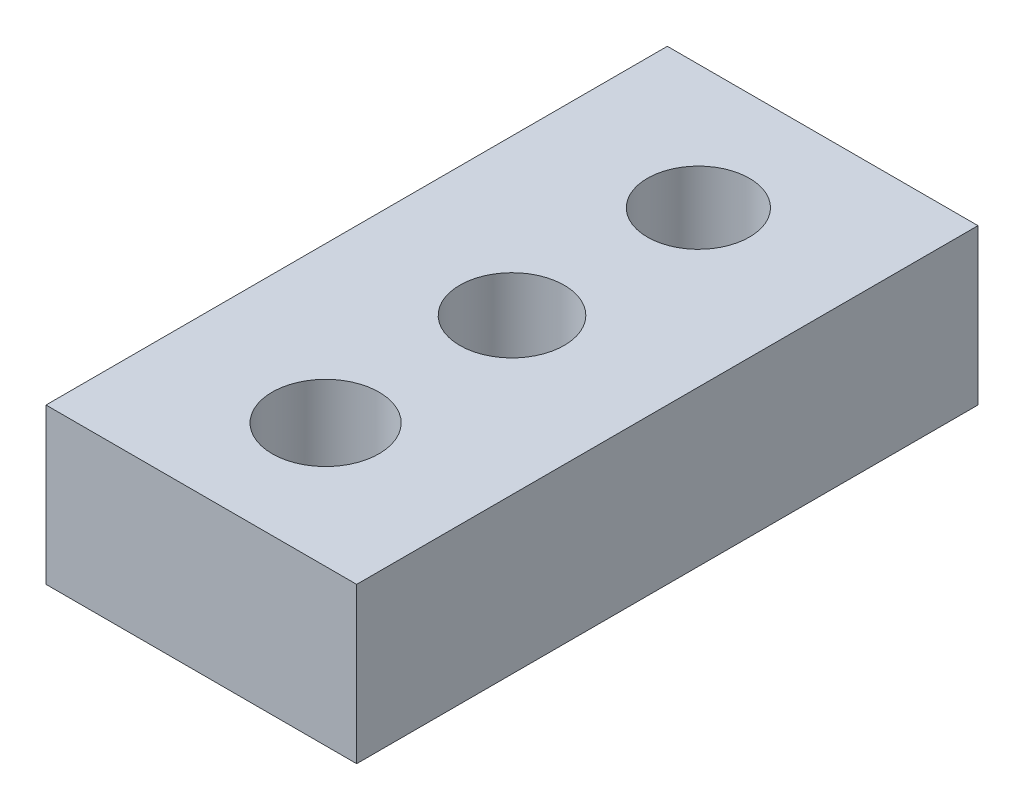
ISO-10303-21;
HEADER;
FILE_DESCRIPTION(('STEP AP214'),'2;1');
FILE_NAME('part.step','',(''),(''),'','','');
FILE_SCHEMA(('AUTOMOTIVE_DESIGN { 1 0 10303 214 1 1 1 1 }'));
ENDSEC;
DATA;
#1=APPLICATION_CONTEXT('core data for automotive mechanical design processes');
#2=APPLICATION_PROTOCOL_DEFINITION('international standard','automotive_design',2000,#1);
#3=PRODUCT_CONTEXT('',#1,'mechanical');
#4=PRODUCT('Part','Part','',(#3));
#5=PRODUCT_RELATED_PRODUCT_CATEGORY('part','',(#4));
#6=PRODUCT_DEFINITION_FORMATION('','',#4);
#7=PRODUCT_DEFINITION_CONTEXT('part definition',#1,'design');
#8=PRODUCT_DEFINITION('design','',#6,#7);
#9=PRODUCT_DEFINITION_SHAPE('','',#8);
#10=(LENGTH_UNIT() NAMED_UNIT(*) SI_UNIT(.MILLI.,.METRE.));
#11=(NAMED_UNIT(*) PLANE_ANGLE_UNIT() SI_UNIT($,.RADIAN.));
#12=(NAMED_UNIT(*) SI_UNIT($,.STERADIAN.) SOLID_ANGLE_UNIT());
#13=UNCERTAINTY_MEASURE_WITH_UNIT(LENGTH_MEASURE(1.E-05),#10,'distance_accuracy_value','');
#14=(GEOMETRIC_REPRESENTATION_CONTEXT(3) GLOBAL_UNCERTAINTY_ASSIGNED_CONTEXT((#13)) GLOBAL_UNIT_ASSIGNED_CONTEXT((#10,
#11,#12)) REPRESENTATION_CONTEXT('',''));
#15=CARTESIAN_POINT('',(0.,0.,0.));
#16=DIRECTION('',(0.,0.,1.));
#17=DIRECTION('',(1.,0.,0.));
#18=AXIS2_PLACEMENT_3D('',#15,#16,#17);
#19=CARTESIAN_POINT('',(6.35,6.35,12.7));
#20=DIRECTION('',(-1.,0.,0.));
#21=DIRECTION('',(0.,0.,1.));
#22=AXIS2_PLACEMENT_3D('',#19,#20,#21);
#23=PLANE('',#22);
#24=DIRECTION('',(0.,0.,-1.));
#25=VECTOR('',#24,1.);
#26=CARTESIAN_POINT('',(6.35,0.,12.7));
#27=LINE('',#26,#25);
#28=CARTESIAN_POINT('',(6.35,0.,12.7));
#29=VERTEX_POINT('',#28);
#30=CARTESIAN_POINT('',(6.35,0.,-12.7));
#31=VERTEX_POINT('',#30);
#32=EDGE_CURVE('E110',#29,#31,#27,.T.);
#33=ORIENTED_EDGE('',*,*,#32,.T.);
#34=DIRECTION('',(0.,-1.,0.));
#35=VECTOR('',#34,1.);
#36=CARTESIAN_POINT('',(6.35,6.35,-12.7));
#37=LINE('',#36,#35);
#38=CARTESIAN_POINT('',(6.35,6.35,-12.7));
#39=VERTEX_POINT('',#38);
#40=EDGE_CURVE('E11',#39,#31,#37,.T.);
#41=ORIENTED_EDGE('',*,*,#40,.F.);
#42=DIRECTION('',(0.,0.,-1.));
#43=VECTOR('',#42,1.);
#44=CARTESIAN_POINT('',(6.35,6.35,12.7));
#45=LINE('',#44,#43);
#46=CARTESIAN_POINT('',(6.35,6.35,12.7));
#47=VERTEX_POINT('',#46);
#48=EDGE_CURVE('E93',#47,#39,#45,.T.);
#49=ORIENTED_EDGE('',*,*,#48,.F.);
#50=DIRECTION('',(0.,-1.,0.));
#51=VECTOR('',#50,1.);
#52=CARTESIAN_POINT('',(6.35,6.35,12.7));
#53=LINE('',#52,#51);
#54=EDGE_CURVE('E106',#47,#29,#53,.T.);
#55=ORIENTED_EDGE('',*,*,#54,.T.);
#56=EDGE_LOOP('',(#33,#41,#49,#55));
#57=FACE_BOUND('',#56,.T.);
#58=ADVANCED_FACE('F39',(#57),#23,.F.);
#59=CARTESIAN_POINT('',(-6.35,6.35,-12.7));
#60=DIRECTION('',(0.,0.,1.));
#61=DIRECTION('',(1.,0.,0.));
#62=AXIS2_PLACEMENT_3D('',#59,#60,#61);
#63=PLANE('',#62);
#64=DIRECTION('',(-1.,0.,0.));
#65=VECTOR('',#64,1.);
#66=CARTESIAN_POINT('',(-6.35,0.,-12.7));
#67=LINE('',#66,#65);
#68=CARTESIAN_POINT('',(-6.35,0.,-12.7));
#69=VERTEX_POINT('',#68);
#70=EDGE_CURVE('E98',#31,#69,#67,.T.);
#71=ORIENTED_EDGE('',*,*,#70,.T.);
#72=DIRECTION('',(0.,-1.,0.));
#73=VECTOR('',#72,1.);
#74=CARTESIAN_POINT('',(-6.35,6.35,-12.7));
#75=LINE('',#74,#73);
#76=CARTESIAN_POINT('',(-6.35,6.35,-12.7));
#77=VERTEX_POINT('',#76);
#78=EDGE_CURVE('E49',#77,#69,#75,.T.);
#79=ORIENTED_EDGE('',*,*,#78,.F.);
#80=DIRECTION('',(-1.,0.,0.));
#81=VECTOR('',#80,1.);
#82=CARTESIAN_POINT('',(-6.35,6.35,-12.7));
#83=LINE('',#82,#81);
#84=EDGE_CURVE('E88',#39,#77,#83,.T.);
#85=ORIENTED_EDGE('',*,*,#84,.F.);
#86=ORIENTED_EDGE('',*,*,#40,.T.);
#87=EDGE_LOOP('',(#71,#79,#85,#86));
#88=FACE_BOUND('',#87,.T.);
#89=ADVANCED_FACE('F97',(#88),#63,.F.);
#90=CARTESIAN_POINT('',(-6.35,6.35,12.7));
#91=DIRECTION('',(1.,0.,0.));
#92=DIRECTION('',(0.,0.,-1.));
#93=AXIS2_PLACEMENT_3D('',#90,#91,#92);
#94=PLANE('',#93);
#95=DIRECTION('',(0.,0.,1.));
#96=VECTOR('',#95,1.);
#97=CARTESIAN_POINT('',(-6.35,0.,12.7));
#98=LINE('',#97,#96);
#99=CARTESIAN_POINT('',(-6.35,0.,12.7));
#100=VERTEX_POINT('',#99);
#101=EDGE_CURVE('E75',#69,#100,#98,.T.);
#102=ORIENTED_EDGE('',*,*,#101,.T.);
#103=DIRECTION('',(0.,-1.,0.));
#104=VECTOR('',#103,1.);
#105=CARTESIAN_POINT('',(-6.35,6.35,12.7));
#106=LINE('',#105,#104);
#107=CARTESIAN_POINT('',(-6.35,6.35,12.7));
#108=VERTEX_POINT('',#107);
#109=EDGE_CURVE('E100',#108,#100,#106,.T.);
#110=ORIENTED_EDGE('',*,*,#109,.F.);
#111=DIRECTION('',(0.,0.,1.));
#112=VECTOR('',#111,1.);
#113=CARTESIAN_POINT('',(-6.35,6.35,12.7));
#114=LINE('',#113,#112);
#115=EDGE_CURVE('E91',#77,#108,#114,.T.);
#116=ORIENTED_EDGE('',*,*,#115,.F.);
#117=ORIENTED_EDGE('',*,*,#78,.T.);
#118=EDGE_LOOP('',(#102,#110,#116,#117));
#119=FACE_BOUND('',#118,.T.);
#120=ADVANCED_FACE('F102',(#119),#94,.F.);
#121=CARTESIAN_POINT('',(-6.35,6.35,12.7));
#122=DIRECTION('',(0.,0.,-1.));
#123=DIRECTION('',(-1.,0.,0.));
#124=AXIS2_PLACEMENT_3D('',#121,#122,#123);
#125=PLANE('',#124);
#126=DIRECTION('',(1.,0.,0.));
#127=VECTOR('',#126,1.);
#128=CARTESIAN_POINT('',(-6.35,0.,12.7));
#129=LINE('',#128,#127);
#130=EDGE_CURVE('E81',#100,#29,#129,.T.);
#131=ORIENTED_EDGE('',*,*,#130,.T.);
#132=ORIENTED_EDGE('',*,*,#54,.F.);
#133=DIRECTION('',(1.,0.,0.));
#134=VECTOR('',#133,1.);
#135=CARTESIAN_POINT('',(-6.35,6.35,12.7));
#136=LINE('',#135,#134);
#137=EDGE_CURVE('E58',#108,#47,#136,.T.);
#138=ORIENTED_EDGE('',*,*,#137,.F.);
#139=ORIENTED_EDGE('',*,*,#109,.T.);
#140=EDGE_LOOP('',(#131,#132,#138,#139));
#141=FACE_BOUND('',#140,.T.);
#142=ADVANCED_FACE('F159',(#141),#125,.F.);
#143=CARTESIAN_POINT('',(0.,6.35,0.));
#144=DIRECTION('',(0.,-1.,0.));
#145=DIRECTION('',(0.,0.,-1.));
#146=AXIS2_PLACEMENT_3D('',#143,#144,#145);
#147=PLANE('',#146);
#148=CARTESIAN_POINT('',(0.,6.35,7.62));
#149=DIRECTION('',(0.,1.,0.));
#150=DIRECTION('',(0.,0.,1.));
#151=AXIS2_PLACEMENT_3D('',#148,#149,#150);
#152=CIRCLE('',#151,2.185);
#153=CARTESIAN_POINT('',(0.,6.35,9.805));
#154=VERTEX_POINT('',#153);
#155=EDGE_CURVE('E141',#154,#154,#152,.T.);
#156=ORIENTED_EDGE('',*,*,#155,.F.);
#157=EDGE_LOOP('',(#156));
#158=FACE_BOUND('',#157,.T.);
#159=CARTESIAN_POINT('',(0.,6.35,0.));
#160=DIRECTION('',(0.,1.,0.));
#161=DIRECTION('',(0.,0.,1.));
#162=AXIS2_PLACEMENT_3D('',#159,#160,#161);
#163=CIRCLE('',#162,2.135);
#164=CARTESIAN_POINT('',(0.,6.35,2.135));
#165=VERTEX_POINT('',#164);
#166=EDGE_CURVE('E128',#165,#165,#163,.T.);
#167=ORIENTED_EDGE('',*,*,#166,.F.);
#168=EDGE_LOOP('',(#167));
#169=FACE_BOUND('',#168,.T.);
#170=CARTESIAN_POINT('',(0.,6.35,-7.62));
#171=DIRECTION('',(0.,1.,0.));
#172=DIRECTION('',(0.,0.,1.));
#173=AXIS2_PLACEMENT_3D('',#170,#171,#172);
#174=CIRCLE('',#173,2.085);
#175=CARTESIAN_POINT('',(0.,6.35,-5.535));
#176=VERTEX_POINT('',#175);
#177=EDGE_CURVE('E127',#176,#176,#174,.T.);
#178=ORIENTED_EDGE('',*,*,#177,.F.);
#179=EDGE_LOOP('',(#178));
#180=FACE_BOUND('',#179,.T.);
#181=ORIENTED_EDGE('',*,*,#48,.T.);
#182=ORIENTED_EDGE('',*,*,#84,.T.);
#183=ORIENTED_EDGE('',*,*,#115,.T.);
#184=ORIENTED_EDGE('',*,*,#137,.T.);
#185=EDGE_LOOP('',(#181,#182,#183,#184));
#186=FACE_BOUND('',#185,.T.);
#187=ADVANCED_FACE('F89',(#158,#169,#180,#186),#147,.F.);
#188=CARTESIAN_POINT('',(0.,0.,0.));
#189=DIRECTION('',(0.,-1.,0.));
#190=DIRECTION('',(0.,0.,-1.));
#191=AXIS2_PLACEMENT_3D('',#188,#189,#190);
#192=PLANE('',#191);
#193=CARTESIAN_POINT('',(0.,0.,7.62));
#194=DIRECTION('',(0.,-1.,0.));
#195=DIRECTION('',(0.,0.,-1.));
#196=AXIS2_PLACEMENT_3D('',#193,#194,#195);
#197=CIRCLE('',#196,2.185);
#198=CARTESIAN_POINT('',(0.,0.,5.435));
#199=VERTEX_POINT('',#198);
#200=EDGE_CURVE('E42',#199,#199,#197,.T.);
#201=ORIENTED_EDGE('',*,*,#200,.F.);
#202=EDGE_LOOP('',(#201));
#203=FACE_BOUND('',#202,.T.);
#204=CARTESIAN_POINT('',(0.,0.,0.));
#205=DIRECTION('',(0.,-1.,0.));
#206=DIRECTION('',(0.,0.,-1.));
#207=AXIS2_PLACEMENT_3D('',#204,#205,#206);
#208=CIRCLE('',#207,2.135);
#209=CARTESIAN_POINT('',(0.,0.,-2.135));
#210=VERTEX_POINT('',#209);
#211=EDGE_CURVE('E124',#210,#210,#208,.T.);
#212=ORIENTED_EDGE('',*,*,#211,.F.);
#213=EDGE_LOOP('',(#212));
#214=FACE_BOUND('',#213,.T.);
#215=CARTESIAN_POINT('',(0.,0.,-7.62));
#216=DIRECTION('',(0.,-1.,0.));
#217=DIRECTION('',(0.,0.,-1.));
#218=AXIS2_PLACEMENT_3D('',#215,#216,#217);
#219=CIRCLE('',#218,2.085);
#220=CARTESIAN_POINT('',(0.,0.,-9.705));
#221=VERTEX_POINT('',#220);
#222=EDGE_CURVE('E114',#221,#221,#219,.T.);
#223=ORIENTED_EDGE('',*,*,#222,.F.);
#224=EDGE_LOOP('',(#223));
#225=FACE_BOUND('',#224,.T.);
#226=ORIENTED_EDGE('',*,*,#32,.F.);
#227=ORIENTED_EDGE('',*,*,#130,.F.);
#228=ORIENTED_EDGE('',*,*,#101,.F.);
#229=ORIENTED_EDGE('',*,*,#70,.F.);
#230=EDGE_LOOP('',(#226,#227,#228,#229));
#231=FACE_BOUND('',#230,.T.);
#232=ADVANCED_FACE('F152',(#203,#214,#225,#231),#192,.T.);
#233=CARTESIAN_POINT('',(0.,6.35,-7.62));
#234=DIRECTION('',(0.,1.,0.));
#235=DIRECTION('',(0.,0.,1.));
#236=AXIS2_PLACEMENT_3D('',#233,#234,#235);
#237=CYLINDRICAL_SURFACE('',#236,2.085);
#238=ORIENTED_EDGE('',*,*,#222,.T.);
#239=EDGE_LOOP('',(#238));
#240=FACE_BOUND('',#239,.T.);
#241=ORIENTED_EDGE('',*,*,#177,.T.);
#242=EDGE_LOOP('',(#241));
#243=FACE_BOUND('',#242,.T.);
#244=ADVANCED_FACE('F149',(#240,#243),#237,.F.);
#245=CARTESIAN_POINT('',(0.,6.35,0.));
#246=DIRECTION('',(0.,1.,0.));
#247=DIRECTION('',(0.,0.,1.));
#248=AXIS2_PLACEMENT_3D('',#245,#246,#247);
#249=CYLINDRICAL_SURFACE('',#248,2.135);
#250=ORIENTED_EDGE('',*,*,#211,.T.);
#251=EDGE_LOOP('',(#250));
#252=FACE_BOUND('',#251,.T.);
#253=ORIENTED_EDGE('',*,*,#166,.T.);
#254=EDGE_LOOP('',(#253));
#255=FACE_BOUND('',#254,.T.);
#256=ADVANCED_FACE('F193',(#252,#255),#249,.F.);
#257=CARTESIAN_POINT('',(0.,6.35,7.62));
#258=DIRECTION('',(0.,1.,0.));
#259=DIRECTION('',(0.,0.,1.));
#260=AXIS2_PLACEMENT_3D('',#257,#258,#259);
#261=CYLINDRICAL_SURFACE('',#260,2.185);
#262=ORIENTED_EDGE('',*,*,#200,.T.);
#263=EDGE_LOOP('',(#262));
#264=FACE_BOUND('',#263,.T.);
#265=ORIENTED_EDGE('',*,*,#155,.T.);
#266=EDGE_LOOP('',(#265));
#267=FACE_BOUND('',#266,.T.);
#268=ADVANCED_FACE('F203',(#264,#267),#261,.F.);
#269=CLOSED_SHELL('',(#58,#89,#120,#142,#187,#232,#244,#256,#268));
#270=MANIFOLD_SOLID_BREP('B2',#269);
#271=ADVANCED_BREP_SHAPE_REPRESENTATION('',(#18,#270),#14);
#272=SHAPE_DEFINITION_REPRESENTATION(#9,#271);
ENDSEC;
END-ISO-10303-21;
